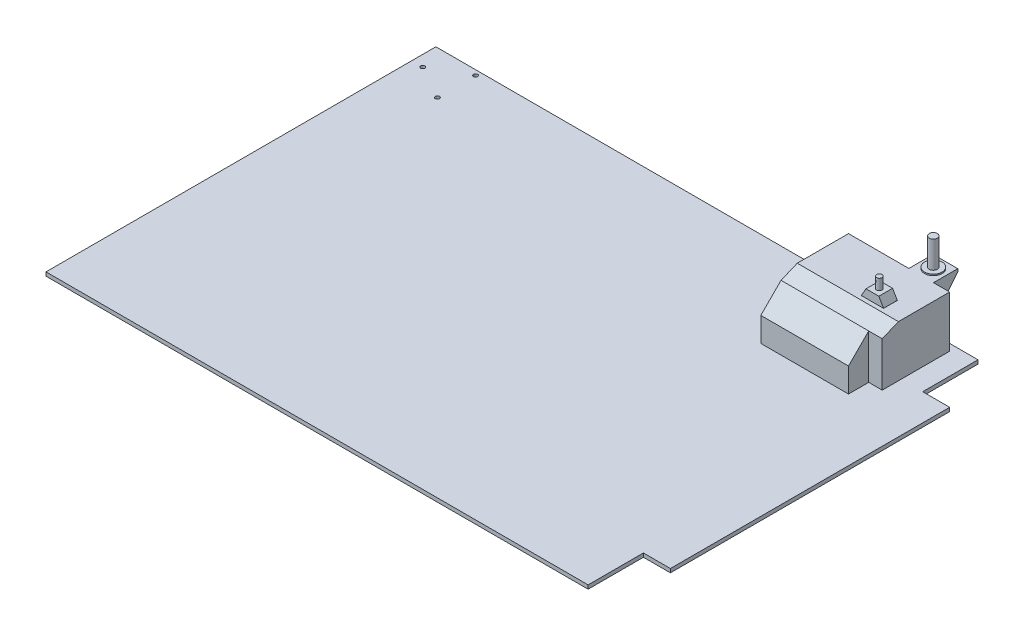
ISO-10303-21;
HEADER;
FILE_DESCRIPTION(('STEP AP214'),'2;1');
FILE_NAME('part.step','',(''),(''),'','','');
FILE_SCHEMA(('AUTOMOTIVE_DESIGN { 1 0 10303 214 1 1 1 1 }'));
ENDSEC;
DATA;
#1=APPLICATION_CONTEXT('core data for automotive mechanical design processes');
#2=APPLICATION_PROTOCOL_DEFINITION('international standard','automotive_design',2000,#1);
#3=PRODUCT_CONTEXT('',#1,'mechanical');
#4=PRODUCT('Part','Part','',(#3));
#5=PRODUCT_RELATED_PRODUCT_CATEGORY('part','',(#4));
#6=PRODUCT_DEFINITION_FORMATION('','',#4);
#7=PRODUCT_DEFINITION_CONTEXT('part definition',#1,'design');
#8=PRODUCT_DEFINITION('design','',#6,#7);
#9=PRODUCT_DEFINITION_SHAPE('','',#8);
#10=(LENGTH_UNIT() NAMED_UNIT(*) SI_UNIT(.MILLI.,.METRE.));
#11=(NAMED_UNIT(*) PLANE_ANGLE_UNIT() SI_UNIT($,.RADIAN.));
#12=(NAMED_UNIT(*) SI_UNIT($,.STERADIAN.) SOLID_ANGLE_UNIT());
#13=UNCERTAINTY_MEASURE_WITH_UNIT(LENGTH_MEASURE(1.E-05),#10,'distance_accuracy_value','');
#14=(GEOMETRIC_REPRESENTATION_CONTEXT(3) GLOBAL_UNCERTAINTY_ASSIGNED_CONTEXT((#13)) GLOBAL_UNIT_ASSIGNED_CONTEXT((#10,
#11,#12)) REPRESENTATION_CONTEXT('',''));
#15=CARTESIAN_POINT('',(0.,0.,0.));
#16=DIRECTION('',(0.,0.,1.));
#17=DIRECTION('',(1.,0.,0.));
#18=AXIS2_PLACEMENT_3D('',#15,#16,#17);
#19=CARTESIAN_POINT('',(0.,40.8,0.));
#20=DIRECTION('',(0.,1.,0.));
#21=DIRECTION('',(0.,0.,1.));
#22=AXIS2_PLACEMENT_3D('',#19,#20,#21);
#23=PLANE('',#22);
#24=CARTESIAN_POINT('',(153.798223583393,40.8,-148.5));
#25=DIRECTION('',(0.,1.,0.));
#26=DIRECTION('',(0.,0.,1.));
#27=AXIS2_PLACEMENT_3D('',#24,#25,#26);
#28=CIRCLE('',#27,6.50000000000002);
#29=CARTESIAN_POINT('',(153.798223583393,40.8,-142.));
#30=VERTEX_POINT('',#29);
#31=EDGE_CURVE('E440',#30,#30,#28,.T.);
#32=ORIENTED_EDGE('',*,*,#31,.F.);
#33=EDGE_LOOP('',(#32));
#34=FACE_BOUND('',#33,.T.);
#35=DIRECTION('',(-1.,0.,0.));
#36=VECTOR('',#35,1.);
#37=CARTESIAN_POINT('',(0.,40.8,-101.5));
#38=LINE('',#37,#36);
#39=CARTESIAN_POINT('',(174.93,40.8,-101.5));
#40=VERTEX_POINT('',#39);
#41=CARTESIAN_POINT('',(99.93,40.8,-101.5));
#42=VERTEX_POINT('',#41);
#43=EDGE_CURVE('E409',#40,#42,#38,.T.);
#44=ORIENTED_EDGE('',*,*,#43,.F.);
#45=DIRECTION('',(0.,0.,1.));
#46=VECTOR('',#45,1.);
#47=CARTESIAN_POINT('',(174.93,40.8,-139.5));
#48=LINE('',#47,#46);
#49=CARTESIAN_POINT('',(174.93,40.8,-139.5));
#50=VERTEX_POINT('',#49);
#51=EDGE_CURVE('E313',#50,#40,#48,.T.);
#52=ORIENTED_EDGE('',*,*,#51,.F.);
#53=DIRECTION('',(-1.,0.,0.));
#54=VECTOR('',#53,1.);
#55=CARTESIAN_POINT('',(174.93,40.8,-139.5));
#56=LINE('',#55,#54);
#57=CARTESIAN_POINT('',(162.93,40.8,-139.5));
#58=VERTEX_POINT('',#57);
#59=EDGE_CURVE('E306',#50,#58,#56,.T.);
#60=ORIENTED_EDGE('',*,*,#59,.T.);
#61=DIRECTION('',(0.,0.,1.));
#62=VECTOR('',#61,1.);
#63=CARTESIAN_POINT('',(162.93,40.8,-157.5));
#64=LINE('',#63,#62);
#65=CARTESIAN_POINT('',(162.93,40.8,-157.5));
#66=VERTEX_POINT('',#65);
#67=EDGE_CURVE('E241',#66,#58,#64,.T.);
#68=ORIENTED_EDGE('',*,*,#67,.F.);
#69=DIRECTION('',(-1.,0.,0.));
#70=VECTOR('',#69,1.);
#71=CARTESIAN_POINT('',(162.93,40.8,-157.5));
#72=LINE('',#71,#70);
#73=CARTESIAN_POINT('',(144.666447166787,40.8,-157.5));
#74=VERTEX_POINT('',#73);
#75=EDGE_CURVE('E239',#66,#74,#72,.T.);
#76=ORIENTED_EDGE('',*,*,#75,.T.);
#77=DIRECTION('',(0.,0.,1.));
#78=VECTOR('',#77,1.);
#79=CARTESIAN_POINT('',(144.666447166787,40.8,-157.5));
#80=LINE('',#79,#78);
#81=CARTESIAN_POINT('',(144.666447166787,40.8,-139.5));
#82=VERTEX_POINT('',#81);
#83=EDGE_CURVE('E255',#74,#82,#80,.T.);
#84=ORIENTED_EDGE('',*,*,#83,.T.);
#85=CARTESIAN_POINT('',(99.93,40.8,-139.5));
#86=VERTEX_POINT('',#85);
#87=EDGE_CURVE('E310',#82,#86,#56,.T.);
#88=ORIENTED_EDGE('',*,*,#87,.T.);
#89=DIRECTION('',(0.,0.,1.));
#90=VECTOR('',#89,1.);
#91=CARTESIAN_POINT('',(99.93,40.8,-139.5));
#92=LINE('',#91,#90);
#93=EDGE_CURVE('E309',#86,#42,#92,.T.);
#94=ORIENTED_EDGE('',*,*,#93,.T.);
#95=EDGE_LOOP('',(#44,#52,#60,#68,#76,#84,#88,#94));
#96=FACE_BOUND('',#95,.T.);
#97=DIRECTION('',(-1.,0.,0.));
#98=VECTOR('',#97,1.);
#99=CARTESIAN_POINT('',(160.93,40.8,-114.672895169853));
#100=LINE('',#99,#98);
#101=CARTESIAN_POINT('',(160.93,40.8,-114.672895169853));
#102=VERTEX_POINT('',#101);
#103=CARTESIAN_POINT('',(144.437579042814,40.8,-114.672895169853));
#104=VERTEX_POINT('',#103);
#105=EDGE_CURVE('E276',#102,#104,#100,.T.);
#106=ORIENTED_EDGE('',*,*,#105,.F.);
#107=DIRECTION('',(0.,0.,-1.));
#108=VECTOR('',#107,1.);
#109=CARTESIAN_POINT('',(160.93,40.8,-104.5));
#110=LINE('',#109,#108);
#111=CARTESIAN_POINT('',(160.93,40.8,-104.5));
#112=VERTEX_POINT('',#111);
#113=EDGE_CURVE('E262',#112,#102,#110,.T.);
#114=ORIENTED_EDGE('',*,*,#113,.F.);
#115=DIRECTION('',(1.,0.,0.));
#116=VECTOR('',#115,1.);
#117=CARTESIAN_POINT('',(160.93,40.8,-104.5));
#118=LINE('',#117,#116);
#119=CARTESIAN_POINT('',(144.437579042814,40.8,-104.5));
#120=VERTEX_POINT('',#119);
#121=EDGE_CURVE('E270',#120,#112,#118,.T.);
#122=ORIENTED_EDGE('',*,*,#121,.F.);
#123=DIRECTION('',(0.,0.,1.));
#124=VECTOR('',#123,1.);
#125=CARTESIAN_POINT('',(144.437579042814,40.8,-104.5));
#126=LINE('',#125,#124);
#127=EDGE_CURVE('E279',#104,#120,#126,.T.);
#128=ORIENTED_EDGE('',*,*,#127,.F.);
#129=EDGE_LOOP('',(#106,#114,#122,#128));
#130=FACE_BOUND('',#129,.T.);
#131=ADVANCED_FACE('F38',(#34,#96,#130),#23,.T.);
#132=CARTESIAN_POINT('',(0.,2.8,0.));
#133=DIRECTION('',(0.,1.,0.));
#134=DIRECTION('',(0.,0.,1.));
#135=AXIS2_PLACEMENT_3D('',#132,#133,#134);
#136=PLANE('',#135);
#137=CARTESIAN_POINT('',(-177.78113513011,2.8,-112.490742035634));
#138=DIRECTION('',(0.,1.,0.));
#139=DIRECTION('',(0.,0.,1.));
#140=AXIS2_PLACEMENT_3D('',#137,#138,#139);
#141=CIRCLE('',#140,1.54999999999999);
#142=CARTESIAN_POINT('',(-177.78113513011,2.8,-110.940742035634));
#143=VERTEX_POINT('',#142);
#144=EDGE_CURVE('E431',#143,#143,#141,.T.);
#145=ORIENTED_EDGE('',*,*,#144,.F.);
#146=EDGE_LOOP('',(#145));
#147=FACE_BOUND('',#146,.T.);
#148=CARTESIAN_POINT('',(-202.78113513011,2.8,-126.640742035634));
#149=DIRECTION('',(0.,1.,0.));
#150=DIRECTION('',(0.,0.,1.));
#151=AXIS2_PLACEMENT_3D('',#148,#149,#150);
#152=CIRCLE('',#151,1.54999999999999);
#153=CARTESIAN_POINT('',(-202.78113513011,2.8,-125.090742035634));
#154=VERTEX_POINT('',#153);
#155=EDGE_CURVE('E789',#154,#154,#152,.T.);
#156=ORIENTED_EDGE('',*,*,#155,.F.);
#157=EDGE_LOOP('',(#156));
#158=FACE_BOUND('',#157,.T.);
#159=CARTESIAN_POINT('',(-177.78113513011,2.8,-140.790742035634));
#160=DIRECTION('',(0.,1.,0.));
#161=DIRECTION('',(0.,0.,1.));
#162=AXIS2_PLACEMENT_3D('',#159,#160,#161);
#163=CIRCLE('',#162,1.54999999999999);
#164=CARTESIAN_POINT('',(-177.78113513011,2.8,-139.240742035634));
#165=VERTEX_POINT('',#164);
#166=EDGE_CURVE('E447',#165,#165,#163,.T.);
#167=ORIENTED_EDGE('',*,*,#166,.F.);
#168=EDGE_LOOP('',(#167));
#169=FACE_BOUND('',#168,.T.);
#170=DIRECTION('',(0.,0.,-1.));
#171=VECTOR('',#170,1.);
#172=CARTESIAN_POINT('',(210.93,2.8,-144.5));
#173=LINE('',#172,#171);
#174=CARTESIAN_POINT('',(210.93,2.8,103.5));
#175=VERTEX_POINT('',#174);
#176=CARTESIAN_POINT('',(210.93,2.8,-103.5));
#177=VERTEX_POINT('',#176);
#178=EDGE_CURVE('E384',#175,#177,#173,.T.);
#179=ORIENTED_EDGE('',*,*,#178,.T.);
#180=DIRECTION('',(-1.,0.,0.));
#181=VECTOR('',#180,1.);
#182=CARTESIAN_POINT('',(210.93,2.8,-103.5));
#183=LINE('',#182,#181);
#184=CARTESIAN_POINT('',(190.93,2.8,-103.5));
#185=VERTEX_POINT('',#184);
#186=EDGE_CURVE('E355',#177,#185,#183,.T.);
#187=ORIENTED_EDGE('',*,*,#186,.T.);
#188=DIRECTION('',(0.,0.,1.));
#189=VECTOR('',#188,1.);
#190=CARTESIAN_POINT('',(190.93,2.8,-144.5));
#191=LINE('',#190,#189);
#192=CARTESIAN_POINT('',(190.93,2.8,-144.5));
#193=VERTEX_POINT('',#192);
#194=EDGE_CURVE('E351',#193,#185,#191,.T.);
#195=ORIENTED_EDGE('',*,*,#194,.F.);
#196=DIRECTION('',(-1.,0.,0.));
#197=VECTOR('',#196,1.);
#198=CARTESIAN_POINT('',(-210.93,2.8,-144.5));
#199=LINE('',#198,#197);
#200=CARTESIAN_POINT('',(-210.93,2.8,-144.5));
#201=VERTEX_POINT('',#200);
#202=EDGE_CURVE('E387',#193,#201,#199,.T.);
#203=ORIENTED_EDGE('',*,*,#202,.T.);
#204=DIRECTION('',(0.,0.,1.));
#205=VECTOR('',#204,1.);
#206=CARTESIAN_POINT('',(-210.93,2.8,-144.5));
#207=LINE('',#206,#205);
#208=CARTESIAN_POINT('',(-210.93,2.8,144.5));
#209=VERTEX_POINT('',#208);
#210=EDGE_CURVE('E390',#201,#209,#207,.T.);
#211=ORIENTED_EDGE('',*,*,#210,.T.);
#212=DIRECTION('',(1.,0.,0.));
#213=VECTOR('',#212,1.);
#214=CARTESIAN_POINT('',(-210.93,2.8,144.5));
#215=LINE('',#214,#213);
#216=CARTESIAN_POINT('',(190.93,2.8,144.5));
#217=VERTEX_POINT('',#216);
#218=EDGE_CURVE('E392',#209,#217,#215,.T.);
#219=ORIENTED_EDGE('',*,*,#218,.T.);
#220=DIRECTION('',(0.,0.,-1.));
#221=VECTOR('',#220,1.);
#222=CARTESIAN_POINT('',(190.93,2.8,144.5));
#223=LINE('',#222,#221);
#224=CARTESIAN_POINT('',(190.93,2.8,103.5));
#225=VERTEX_POINT('',#224);
#226=EDGE_CURVE('E375',#217,#225,#223,.T.);
#227=ORIENTED_EDGE('',*,*,#226,.T.);
#228=DIRECTION('',(-1.,0.,0.));
#229=VECTOR('',#228,1.);
#230=CARTESIAN_POINT('',(210.93,2.8,103.5));
#231=LINE('',#230,#229);
#232=EDGE_CURVE('E358',#175,#225,#231,.T.);
#233=ORIENTED_EDGE('',*,*,#232,.F.);
#234=EDGE_LOOP('',(#179,#187,#195,#203,#211,#219,#227,#233));
#235=FACE_BOUND('',#234,.T.);
#236=DIRECTION('',(0.,0.,-1.));
#237=VECTOR('',#236,1.);
#238=CARTESIAN_POINT('',(99.93,2.8,-74.5));
#239=LINE('',#238,#237);
#240=CARTESIAN_POINT('',(99.93,2.8,-74.5));
#241=VERTEX_POINT('',#240);
#242=CARTESIAN_POINT('',(99.9299999999999,2.8,-139.5));
#243=VERTEX_POINT('',#242);
#244=EDGE_CURVE('E319',#241,#243,#239,.T.);
#245=ORIENTED_EDGE('',*,*,#244,.T.);
#246=DIRECTION('',(-1.,0.,0.));
#247=VECTOR('',#246,1.);
#248=CARTESIAN_POINT('',(174.93,2.8,-139.5));
#249=LINE('',#248,#247);
#250=CARTESIAN_POINT('',(174.93,2.8,-139.5));
#251=VERTEX_POINT('',#250);
#252=EDGE_CURVE('E305',#251,#243,#249,.T.);
#253=ORIENTED_EDGE('',*,*,#252,.F.);
#254=DIRECTION('',(0.,0.,1.));
#255=VECTOR('',#254,1.);
#256=CARTESIAN_POINT('',(174.93,2.8,-139.5));
#257=LINE('',#256,#255);
#258=CARTESIAN_POINT('',(174.93,2.8,-89.5));
#259=VERTEX_POINT('',#258);
#260=EDGE_CURVE('E330',#251,#259,#257,.T.);
#261=ORIENTED_EDGE('',*,*,#260,.T.);
#262=DIRECTION('',(-1.,0.,0.));
#263=VECTOR('',#262,1.);
#264=CARTESIAN_POINT('',(174.93,2.8,-89.5));
#265=LINE('',#264,#263);
#266=CARTESIAN_POINT('',(164.93,2.8,-89.5));
#267=VERTEX_POINT('',#266);
#268=EDGE_CURVE('E327',#259,#267,#265,.T.);
#269=ORIENTED_EDGE('',*,*,#268,.T.);
#270=DIRECTION('',(0.,0.,1.));
#271=VECTOR('',#270,1.);
#272=CARTESIAN_POINT('',(164.93,2.8,-89.5));
#273=LINE('',#272,#271);
#274=CARTESIAN_POINT('',(164.93,2.8,-74.5));
#275=VERTEX_POINT('',#274);
#276=EDGE_CURVE('E324',#267,#275,#273,.T.);
#277=ORIENTED_EDGE('',*,*,#276,.T.);
#278=DIRECTION('',(-1.,0.,0.));
#279=VECTOR('',#278,1.);
#280=CARTESIAN_POINT('',(164.93,2.8,-74.5));
#281=LINE('',#280,#279);
#282=EDGE_CURVE('E321',#275,#241,#281,.T.);
#283=ORIENTED_EDGE('',*,*,#282,.T.);
#284=EDGE_LOOP('',(#245,#253,#261,#269,#277,#283));
#285=FACE_BOUND('',#284,.T.);
#286=ADVANCED_FACE('F476',(#147,#158,#169,#235,#285),#136,.T.);
#287=CARTESIAN_POINT('',(210.93,2.8,-144.5));
#288=DIRECTION('',(-1.,0.,0.));
#289=DIRECTION('',(0.,0.,1.));
#290=AXIS2_PLACEMENT_3D('',#287,#288,#289);
#291=PLANE('',#290);
#292=DIRECTION('',(0.,1.,0.));
#293=VECTOR('',#292,1.);
#294=CARTESIAN_POINT('',(210.93,0.,-103.5));
#295=LINE('',#294,#293);
#296=CARTESIAN_POINT('',(210.93,0.,-103.5));
#297=VERTEX_POINT('',#296);
#298=EDGE_CURVE('E354',#297,#177,#295,.T.);
#299=ORIENTED_EDGE('',*,*,#298,.T.);
#300=ORIENTED_EDGE('',*,*,#178,.F.);
#301=DIRECTION('',(0.,1.,0.));
#302=VECTOR('',#301,1.);
#303=CARTESIAN_POINT('',(210.93,0.,103.5));
#304=LINE('',#303,#302);
#305=CARTESIAN_POINT('',(210.93,0.,103.5));
#306=VERTEX_POINT('',#305);
#307=EDGE_CURVE('E346',#306,#175,#304,.T.);
#308=ORIENTED_EDGE('',*,*,#307,.F.);
#309=DIRECTION('',(0.,0.,-1.));
#310=VECTOR('',#309,1.);
#311=CARTESIAN_POINT('',(210.93,0.,-144.5));
#312=LINE('',#311,#310);
#313=EDGE_CURVE('E367',#306,#297,#312,.T.);
#314=ORIENTED_EDGE('',*,*,#313,.T.);
#315=EDGE_LOOP('',(#299,#300,#308,#314));
#316=FACE_BOUND('',#315,.T.);
#317=ADVANCED_FACE('F482',(#316),#291,.F.);
#318=CARTESIAN_POINT('',(-210.93,2.8,144.5));
#319=DIRECTION('',(0.,0.,-1.));
#320=DIRECTION('',(-1.,0.,0.));
#321=AXIS2_PLACEMENT_3D('',#318,#319,#320);
#322=PLANE('',#321);
#323=DIRECTION('',(0.,1.,0.));
#324=VECTOR('',#323,1.);
#325=CARTESIAN_POINT('',(190.93,0.,144.5));
#326=LINE('',#325,#324);
#327=CARTESIAN_POINT('',(190.93,0.,144.5));
#328=VERTEX_POINT('',#327);
#329=EDGE_CURVE('E371',#328,#217,#326,.T.);
#330=ORIENTED_EDGE('',*,*,#329,.T.);
#331=ORIENTED_EDGE('',*,*,#218,.F.);
#332=DIRECTION('',(0.,-1.,0.));
#333=VECTOR('',#332,1.);
#334=CARTESIAN_POINT('',(-210.93,2.8,144.5));
#335=LINE('',#334,#333);
#336=CARTESIAN_POINT('',(-210.93,0.,144.5));
#337=VERTEX_POINT('',#336);
#338=EDGE_CURVE('E395',#209,#337,#335,.T.);
#339=ORIENTED_EDGE('',*,*,#338,.T.);
#340=DIRECTION('',(1.,0.,0.));
#341=VECTOR('',#340,1.);
#342=CARTESIAN_POINT('',(-210.93,0.,144.5));
#343=LINE('',#342,#341);
#344=EDGE_CURVE('E388',#337,#328,#343,.T.);
#345=ORIENTED_EDGE('',*,*,#344,.T.);
#346=EDGE_LOOP('',(#330,#331,#339,#345));
#347=FACE_BOUND('',#346,.T.);
#348=ADVANCED_FACE('F533',(#347),#322,.F.);
#349=CARTESIAN_POINT('',(0.,0.,0.));
#350=DIRECTION('',(0.,1.,0.));
#351=DIRECTION('',(0.,0.,1.));
#352=AXIS2_PLACEMENT_3D('',#349,#350,#351);
#353=PLANE('',#352);
#354=CARTESIAN_POINT('',(-177.78113513011,0.,-112.490742035634));
#355=DIRECTION('',(0.,1.,0.));
#356=DIRECTION('',(0.,0.,1.));
#357=AXIS2_PLACEMENT_3D('',#354,#355,#356);
#358=CIRCLE('',#357,1.54999999999999);
#359=CARTESIAN_POINT('',(-177.78113513011,0.,-110.940742035634));
#360=VERTEX_POINT('',#359);
#361=EDGE_CURVE('E43',#360,#360,#358,.T.);
#362=ORIENTED_EDGE('',*,*,#361,.T.);
#363=EDGE_LOOP('',(#362));
#364=FACE_BOUND('',#363,.T.);
#365=CARTESIAN_POINT('',(-202.78113513011,0.,-126.640742035634));
#366=DIRECTION('',(0.,1.,0.));
#367=DIRECTION('',(0.,0.,1.));
#368=AXIS2_PLACEMENT_3D('',#365,#366,#367);
#369=CIRCLE('',#368,1.54999999999999);
#370=CARTESIAN_POINT('',(-202.78113513011,0.,-125.090742035634));
#371=VERTEX_POINT('',#370);
#372=EDGE_CURVE('E430',#371,#371,#369,.T.);
#373=ORIENTED_EDGE('',*,*,#372,.T.);
#374=EDGE_LOOP('',(#373));
#375=FACE_BOUND('',#374,.T.);
#376=CARTESIAN_POINT('',(-177.78113513011,0.,-140.790742035634));
#377=DIRECTION('',(0.,1.,0.));
#378=DIRECTION('',(0.,0.,1.));
#379=AXIS2_PLACEMENT_3D('',#376,#377,#378);
#380=CIRCLE('',#379,1.54999999999999);
#381=CARTESIAN_POINT('',(-177.78113513011,0.,-139.240742035634));
#382=VERTEX_POINT('',#381);
#383=EDGE_CURVE('E428',#382,#382,#380,.T.);
#384=ORIENTED_EDGE('',*,*,#383,.T.);
#385=EDGE_LOOP('',(#384));
#386=FACE_BOUND('',#385,.T.);
#387=DIRECTION('',(-1.,0.,0.));
#388=VECTOR('',#387,1.);
#389=CARTESIAN_POINT('',(210.93,0.,-103.5));
#390=LINE('',#389,#388);
#391=CARTESIAN_POINT('',(190.93,0.,-103.5));
#392=VERTEX_POINT('',#391);
#393=EDGE_CURVE('E347',#297,#392,#390,.T.);
#394=ORIENTED_EDGE('',*,*,#393,.F.);
#395=ORIENTED_EDGE('',*,*,#313,.F.);
#396=DIRECTION('',(-1.,0.,0.));
#397=VECTOR('',#396,1.);
#398=CARTESIAN_POINT('',(210.93,0.,103.5));
#399=LINE('',#398,#397);
#400=CARTESIAN_POINT('',(190.93,0.,103.5));
#401=VERTEX_POINT('',#400);
#402=EDGE_CURVE('E378',#306,#401,#399,.T.);
#403=ORIENTED_EDGE('',*,*,#402,.T.);
#404=DIRECTION('',(0.,0.,-1.));
#405=VECTOR('',#404,1.);
#406=CARTESIAN_POINT('',(190.93,0.,144.5));
#407=LINE('',#406,#405);
#408=EDGE_CURVE('E370',#328,#401,#407,.T.);
#409=ORIENTED_EDGE('',*,*,#408,.F.);
#410=ORIENTED_EDGE('',*,*,#344,.F.);
#411=DIRECTION('',(0.,0.,1.));
#412=VECTOR('',#411,1.);
#413=CARTESIAN_POINT('',(-210.93,0.,-144.5));
#414=LINE('',#413,#412);
#415=CARTESIAN_POINT('',(-210.93,0.,-144.5));
#416=VERTEX_POINT('',#415);
#417=EDGE_CURVE('E400',#416,#337,#414,.T.);
#418=ORIENTED_EDGE('',*,*,#417,.F.);
#419=DIRECTION('',(-1.,0.,0.));
#420=VECTOR('',#419,1.);
#421=CARTESIAN_POINT('',(-210.93,0.,-144.5));
#422=LINE('',#421,#420);
#423=CARTESIAN_POINT('',(190.93,0.,-144.5));
#424=VERTEX_POINT('',#423);
#425=EDGE_CURVE('E398',#424,#416,#422,.T.);
#426=ORIENTED_EDGE('',*,*,#425,.F.);
#427=DIRECTION('',(0.,0.,1.));
#428=VECTOR('',#427,1.);
#429=CARTESIAN_POINT('',(190.93,0.,-144.5));
#430=LINE('',#429,#428);
#431=EDGE_CURVE('E350',#424,#392,#430,.T.);
#432=ORIENTED_EDGE('',*,*,#431,.T.);
#433=EDGE_LOOP('',(#394,#395,#403,#409,#410,#418,#426,#432));
#434=FACE_BOUND('',#433,.T.);
#435=ADVANCED_FACE('F529',(#364,#375,#386,#434),#353,.F.);
#436=CARTESIAN_POINT('',(-210.93,2.8,-144.5));
#437=DIRECTION('',(0.,0.,1.));
#438=DIRECTION('',(1.,0.,0.));
#439=AXIS2_PLACEMENT_3D('',#436,#437,#438);
#440=PLANE('',#439);
#441=ORIENTED_EDGE('',*,*,#202,.F.);
#442=DIRECTION('',(0.,1.,0.));
#443=VECTOR('',#442,1.);
#444=CARTESIAN_POINT('',(190.93,0.,-144.5));
#445=LINE('',#444,#443);
#446=EDGE_CURVE('E363',#424,#193,#445,.T.);
#447=ORIENTED_EDGE('',*,*,#446,.F.);
#448=ORIENTED_EDGE('',*,*,#425,.T.);
#449=DIRECTION('',(0.,-1.,0.));
#450=VECTOR('',#449,1.);
#451=CARTESIAN_POINT('',(-210.93,2.8,-144.5));
#452=LINE('',#451,#450);
#453=EDGE_CURVE('E406',#201,#416,#452,.T.);
#454=ORIENTED_EDGE('',*,*,#453,.F.);
#455=EDGE_LOOP('',(#441,#447,#448,#454));
#456=FACE_BOUND('',#455,.T.);
#457=ADVANCED_FACE('F532',(#456),#440,.F.);
#458=CARTESIAN_POINT('',(-210.93,2.8,-144.5));
#459=DIRECTION('',(1.,0.,0.));
#460=DIRECTION('',(0.,0.,-1.));
#461=AXIS2_PLACEMENT_3D('',#458,#459,#460);
#462=PLANE('',#461);
#463=ORIENTED_EDGE('',*,*,#417,.T.);
#464=ORIENTED_EDGE('',*,*,#338,.F.);
#465=ORIENTED_EDGE('',*,*,#210,.F.);
#466=ORIENTED_EDGE('',*,*,#453,.T.);
#467=EDGE_LOOP('',(#463,#464,#465,#466));
#468=FACE_BOUND('',#467,.T.);
#469=ADVANCED_FACE('F524',(#468),#462,.F.);
#470=CARTESIAN_POINT('',(210.93,0.,103.5));
#471=DIRECTION('',(0.,0.,-1.));
#472=DIRECTION('',(-1.,0.,0.));
#473=AXIS2_PLACEMENT_3D('',#470,#471,#472);
#474=PLANE('',#473);
#475=ORIENTED_EDGE('',*,*,#232,.T.);
#476=DIRECTION('',(0.,1.,0.));
#477=VECTOR('',#476,1.);
#478=CARTESIAN_POINT('',(190.93,0.,103.5));
#479=LINE('',#478,#477);
#480=EDGE_CURVE('E368',#401,#225,#479,.T.);
#481=ORIENTED_EDGE('',*,*,#480,.F.);
#482=ORIENTED_EDGE('',*,*,#402,.F.);
#483=ORIENTED_EDGE('',*,*,#307,.T.);
#484=EDGE_LOOP('',(#475,#481,#482,#483));
#485=FACE_BOUND('',#484,.T.);
#486=ADVANCED_FACE('F521',(#485),#474,.F.);
#487=CARTESIAN_POINT('',(190.93,0.,144.5));
#488=DIRECTION('',(1.,0.,0.));
#489=DIRECTION('',(0.,0.,-1.));
#490=AXIS2_PLACEMENT_3D('',#487,#488,#489);
#491=PLANE('',#490);
#492=ORIENTED_EDGE('',*,*,#226,.F.);
#493=ORIENTED_EDGE('',*,*,#329,.F.);
#494=ORIENTED_EDGE('',*,*,#408,.T.);
#495=ORIENTED_EDGE('',*,*,#480,.T.);
#496=EDGE_LOOP('',(#492,#493,#494,#495));
#497=FACE_BOUND('',#496,.T.);
#498=ADVANCED_FACE('F519',(#497),#491,.T.);
#499=CARTESIAN_POINT('',(210.93,0.,-103.5));
#500=DIRECTION('',(0.,0.,-1.));
#501=DIRECTION('',(-1.,0.,0.));
#502=AXIS2_PLACEMENT_3D('',#499,#500,#501);
#503=PLANE('',#502);
#504=ORIENTED_EDGE('',*,*,#186,.F.);
#505=ORIENTED_EDGE('',*,*,#298,.F.);
#506=ORIENTED_EDGE('',*,*,#393,.T.);
#507=DIRECTION('',(0.,1.,0.));
#508=VECTOR('',#507,1.);
#509=CARTESIAN_POINT('',(190.93,0.,-103.5));
#510=LINE('',#509,#508);
#511=EDGE_CURVE('E365',#392,#185,#510,.T.);
#512=ORIENTED_EDGE('',*,*,#511,.T.);
#513=EDGE_LOOP('',(#504,#505,#506,#512));
#514=FACE_BOUND('',#513,.T.);
#515=ADVANCED_FACE('F515',(#514),#503,.T.);
#516=CARTESIAN_POINT('',(190.93,0.,-144.5));
#517=DIRECTION('',(-1.,0.,0.));
#518=DIRECTION('',(0.,0.,1.));
#519=AXIS2_PLACEMENT_3D('',#516,#517,#518);
#520=PLANE('',#519);
#521=ORIENTED_EDGE('',*,*,#194,.T.);
#522=ORIENTED_EDGE('',*,*,#511,.F.);
#523=ORIENTED_EDGE('',*,*,#431,.F.);
#524=ORIENTED_EDGE('',*,*,#446,.T.);
#525=EDGE_LOOP('',(#521,#522,#523,#524));
#526=FACE_BOUND('',#525,.T.);
#527=ADVANCED_FACE('F512',(#526),#520,.F.);
#528=CARTESIAN_POINT('',(174.93,40.8,-139.5));
#529=DIRECTION('',(0.,0.,1.));
#530=DIRECTION('',(1.,0.,0.));
#531=AXIS2_PLACEMENT_3D('',#528,#529,#530);
#532=PLANE('',#531);
#533=ORIENTED_EDGE('',*,*,#87,.F.);
#534=DIRECTION('',(0.,-1.,0.));
#535=VECTOR('',#534,1.);
#536=CARTESIAN_POINT('',(144.666447166787,40.8,-139.5));
#537=LINE('',#536,#535);
#538=CARTESIAN_POINT('',(144.666447166787,21.8,-139.5));
#539=VERTEX_POINT('',#538);
#540=EDGE_CURVE('E250',#82,#539,#537,.T.);
#541=ORIENTED_EDGE('',*,*,#540,.T.);
#542=DIRECTION('',(-1.,0.,0.));
#543=VECTOR('',#542,1.);
#544=CARTESIAN_POINT('',(162.93,21.8,-139.5));
#545=LINE('',#544,#543);
#546=CARTESIAN_POINT('',(162.93,21.8,-139.5));
#547=VERTEX_POINT('',#546);
#548=EDGE_CURVE('E247',#547,#539,#545,.T.);
#549=ORIENTED_EDGE('',*,*,#548,.F.);
#550=DIRECTION('',(0.,-1.,0.));
#551=VECTOR('',#550,1.);
#552=CARTESIAN_POINT('',(162.93,40.8,-139.5));
#553=LINE('',#552,#551);
#554=EDGE_CURVE('E252',#58,#547,#553,.T.);
#555=ORIENTED_EDGE('',*,*,#554,.F.);
#556=ORIENTED_EDGE('',*,*,#59,.F.);
#557=DIRECTION('',(0.,-1.,0.));
#558=VECTOR('',#557,1.);
#559=CARTESIAN_POINT('',(174.93,40.8,-139.5));
#560=LINE('',#559,#558);
#561=EDGE_CURVE('E316',#50,#251,#560,.T.);
#562=ORIENTED_EDGE('',*,*,#561,.T.);
#563=ORIENTED_EDGE('',*,*,#252,.T.);
#564=DIRECTION('',(0.,-1.,0.));
#565=VECTOR('',#564,1.);
#566=CARTESIAN_POINT('',(99.93,40.8,-139.5));
#567=LINE('',#566,#565);
#568=EDGE_CURVE('E343',#86,#243,#567,.T.);
#569=ORIENTED_EDGE('',*,*,#568,.F.);
#570=EDGE_LOOP('',(#533,#541,#549,#555,#556,#562,#563,#569));
#571=FACE_BOUND('',#570,.T.);
#572=ADVANCED_FACE('F461',(#571),#532,.F.);
#573=CARTESIAN_POINT('',(99.93,40.8,-74.5));
#574=DIRECTION('',(-1.,0.,0.));
#575=DIRECTION('',(0.,0.,1.));
#576=AXIS2_PLACEMENT_3D('',#573,#574,#575);
#577=PLANE('',#576);
#578=DIRECTION('',(0.,-0.707106781186548,0.707106781186548));
#579=VECTOR('',#578,1.);
#580=CARTESIAN_POINT('',(99.93,30.8,-84.5));
#581=LINE('',#580,#579);
#582=CARTESIAN_POINT('',(99.93,35.8,-89.5));
#583=VERTEX_POINT('',#582);
#584=CARTESIAN_POINT('',(99.93,20.8,-74.5));
#585=VERTEX_POINT('',#584);
#586=EDGE_CURVE('E295',#583,#585,#581,.T.);
#587=ORIENTED_EDGE('',*,*,#586,.F.);
#588=DIRECTION('',(0.,-0.384615384615384,0.923076923076923));
#589=VECTOR('',#588,1.);
#590=CARTESIAN_POINT('',(99.93,31.2142011834319,-78.4940828402367));
#591=LINE('',#590,#589);
#592=EDGE_CURVE('E302',#42,#583,#591,.T.);
#593=ORIENTED_EDGE('',*,*,#592,.F.);
#594=ORIENTED_EDGE('',*,*,#93,.F.);
#595=ORIENTED_EDGE('',*,*,#568,.T.);
#596=ORIENTED_EDGE('',*,*,#244,.F.);
#597=DIRECTION('',(0.,-1.,0.));
#598=VECTOR('',#597,1.);
#599=CARTESIAN_POINT('',(99.93,40.8,-74.5));
#600=LINE('',#599,#598);
#601=EDGE_CURVE('E341',#585,#241,#600,.T.);
#602=ORIENTED_EDGE('',*,*,#601,.F.);
#603=EDGE_LOOP('',(#587,#593,#594,#595,#596,#602));
#604=FACE_BOUND('',#603,.T.);
#605=ADVANCED_FACE('F505',(#604),#577,.T.);
#606=CARTESIAN_POINT('',(164.93,40.8,-74.5));
#607=DIRECTION('',(0.,0.,1.));
#608=DIRECTION('',(1.,0.,0.));
#609=AXIS2_PLACEMENT_3D('',#606,#607,#608);
#610=PLANE('',#609);
#611=DIRECTION('',(1.,0.,0.));
#612=VECTOR('',#611,1.);
#613=CARTESIAN_POINT('',(-210.93,20.8,-74.5));
#614=LINE('',#613,#612);
#615=CARTESIAN_POINT('',(164.93,20.8,-74.5));
#616=VERTEX_POINT('',#615);
#617=EDGE_CURVE('E293',#585,#616,#614,.T.);
#618=ORIENTED_EDGE('',*,*,#617,.F.);
#619=ORIENTED_EDGE('',*,*,#601,.T.);
#620=ORIENTED_EDGE('',*,*,#282,.F.);
#621=DIRECTION('',(0.,-1.,0.));
#622=VECTOR('',#621,1.);
#623=CARTESIAN_POINT('',(164.93,40.8,-74.5));
#624=LINE('',#623,#622);
#625=EDGE_CURVE('E339',#616,#275,#624,.T.);
#626=ORIENTED_EDGE('',*,*,#625,.F.);
#627=EDGE_LOOP('',(#618,#619,#620,#626));
#628=FACE_BOUND('',#627,.T.);
#629=ADVANCED_FACE('F501',(#628),#610,.T.);
#630=CARTESIAN_POINT('',(164.93,40.8,-89.5));
#631=DIRECTION('',(1.,0.,0.));
#632=DIRECTION('',(0.,0.,-1.));
#633=AXIS2_PLACEMENT_3D('',#630,#631,#632);
#634=PLANE('',#633);
#635=DIRECTION('',(0.,0.707106781186548,-0.707106781186548));
#636=VECTOR('',#635,1.);
#637=CARTESIAN_POINT('',(164.93,-26.85,-26.85));
#638=LINE('',#637,#636);
#639=CARTESIAN_POINT('',(164.93,35.8,-89.5));
#640=VERTEX_POINT('',#639);
#641=EDGE_CURVE('E291',#616,#640,#638,.T.);
#642=ORIENTED_EDGE('',*,*,#641,.F.);
#643=ORIENTED_EDGE('',*,*,#625,.T.);
#644=ORIENTED_EDGE('',*,*,#276,.F.);
#645=DIRECTION('',(0.,-1.,0.));
#646=VECTOR('',#645,1.);
#647=CARTESIAN_POINT('',(164.93,40.8,-89.5));
#648=LINE('',#647,#646);
#649=EDGE_CURVE('E337',#640,#267,#648,.T.);
#650=ORIENTED_EDGE('',*,*,#649,.F.);
#651=EDGE_LOOP('',(#642,#643,#644,#650));
#652=FACE_BOUND('',#651,.T.);
#653=ADVANCED_FACE('F497',(#652),#634,.T.);
#654=CARTESIAN_POINT('',(174.93,40.8,-89.5));
#655=DIRECTION('',(0.,0.,1.));
#656=DIRECTION('',(1.,0.,0.));
#657=AXIS2_PLACEMENT_3D('',#654,#655,#656);
#658=PLANE('',#657);
#659=DIRECTION('',(1.,0.,0.));
#660=VECTOR('',#659,1.);
#661=CARTESIAN_POINT('',(-210.93,35.8,-89.5));
#662=LINE('',#661,#660);
#663=CARTESIAN_POINT('',(174.93,35.8,-89.5));
#664=VERTEX_POINT('',#663);
#665=EDGE_CURVE('E299',#640,#664,#662,.T.);
#666=ORIENTED_EDGE('',*,*,#665,.F.);
#667=ORIENTED_EDGE('',*,*,#649,.T.);
#668=ORIENTED_EDGE('',*,*,#268,.F.);
#669=DIRECTION('',(0.,-1.,0.));
#670=VECTOR('',#669,1.);
#671=CARTESIAN_POINT('',(174.93,40.8,-89.5));
#672=LINE('',#671,#670);
#673=EDGE_CURVE('E335',#664,#259,#672,.T.);
#674=ORIENTED_EDGE('',*,*,#673,.F.);
#675=EDGE_LOOP('',(#666,#667,#668,#674));
#676=FACE_BOUND('',#675,.T.);
#677=ADVANCED_FACE('F493',(#676),#658,.T.);
#678=CARTESIAN_POINT('',(174.93,40.8,-139.5));
#679=DIRECTION('',(1.,0.,0.));
#680=DIRECTION('',(0.,0.,-1.));
#681=AXIS2_PLACEMENT_3D('',#678,#679,#680);
#682=PLANE('',#681);
#683=DIRECTION('',(0.,0.384615384615385,-0.923076923076923));
#684=VECTOR('',#683,1.);
#685=CARTESIAN_POINT('',(174.93,35.8,-89.5));
#686=LINE('',#685,#684);
#687=EDGE_CURVE('E297',#664,#40,#686,.T.);
#688=ORIENTED_EDGE('',*,*,#687,.F.);
#689=ORIENTED_EDGE('',*,*,#673,.T.);
#690=ORIENTED_EDGE('',*,*,#260,.F.);
#691=ORIENTED_EDGE('',*,*,#561,.F.);
#692=ORIENTED_EDGE('',*,*,#51,.T.);
#693=EDGE_LOOP('',(#688,#689,#690,#691,#692));
#694=FACE_BOUND('',#693,.T.);
#695=ADVANCED_FACE('F490',(#694),#682,.T.);
#696=CARTESIAN_POINT('',(-210.93,35.8,-89.5));
#697=DIRECTION('',(0.,-0.923076923076923,-0.384615384615385));
#698=DIRECTION('',(0.,0.384615384615384,-0.923076923076923));
#699=AXIS2_PLACEMENT_3D('',#696,#697,#698);
#700=PLANE('',#699);
#701=ORIENTED_EDGE('',*,*,#592,.T.);
#702=EDGE_CURVE('E301',#583,#640,#662,.T.);
#703=ORIENTED_EDGE('',*,*,#702,.T.);
#704=ORIENTED_EDGE('',*,*,#665,.T.);
#705=ORIENTED_EDGE('',*,*,#687,.T.);
#706=ORIENTED_EDGE('',*,*,#43,.T.);
#707=EDGE_LOOP('',(#701,#703,#704,#705,#706));
#708=FACE_BOUND('',#707,.T.);
#709=ADVANCED_FACE('F488',(#708),#700,.F.);
#710=CARTESIAN_POINT('',(-210.93,-26.85,-26.85));
#711=DIRECTION('',(0.,-0.707106781186548,-0.707106781186548));
#712=DIRECTION('',(0.,0.707106781186548,-0.707106781186548));
#713=AXIS2_PLACEMENT_3D('',#710,#711,#712);
#714=PLANE('',#713);
#715=ORIENTED_EDGE('',*,*,#586,.T.);
#716=ORIENTED_EDGE('',*,*,#617,.T.);
#717=ORIENTED_EDGE('',*,*,#641,.T.);
#718=ORIENTED_EDGE('',*,*,#702,.F.);
#719=EDGE_LOOP('',(#715,#716,#717,#718));
#720=FACE_BOUND('',#719,.T.);
#721=ADVANCED_FACE('F591',(#720),#714,.F.);
#722=CARTESIAN_POINT('',(160.93,46.86,-104.5));
#723=DIRECTION('',(-1.,0.,0.));
#724=DIRECTION('',(0.,0.,1.));
#725=AXIS2_PLACEMENT_3D('',#722,#723,#724);
#726=PLANE('',#725);
#727=DIRECTION('',(0.,-1.,0.));
#728=VECTOR('',#727,1.);
#729=CARTESIAN_POINT('',(160.93,46.86,-114.672895169853));
#730=LINE('',#729,#728);
#731=CARTESIAN_POINT('',(160.93,40.8599999999999,-114.672895169853));
#732=VERTEX_POINT('',#731);
#733=EDGE_CURVE('E289',#732,#102,#730,.T.);
#734=ORIENTED_EDGE('',*,*,#733,.F.);
#735=DIRECTION('',(0.,0.,1.));
#736=VECTOR('',#735,1.);
#737=CARTESIAN_POINT('',(160.93,40.8599999999999,-104.5));
#738=LINE('',#737,#736);
#739=CARTESIAN_POINT('',(160.93,40.8599999999999,-104.5));
#740=VERTEX_POINT('',#739);
#741=EDGE_CURVE('E421',#732,#740,#738,.T.);
#742=ORIENTED_EDGE('',*,*,#741,.T.);
#743=DIRECTION('',(0.,-1.,0.));
#744=VECTOR('',#743,1.);
#745=CARTESIAN_POINT('',(160.93,46.86,-104.5));
#746=LINE('',#745,#744);
#747=EDGE_CURVE('E273',#740,#112,#746,.T.);
#748=ORIENTED_EDGE('',*,*,#747,.T.);
#749=ORIENTED_EDGE('',*,*,#113,.T.);
#750=EDGE_LOOP('',(#734,#742,#748,#749));
#751=FACE_BOUND('',#750,.T.);
#752=ADVANCED_FACE('F581',(#751),#726,.F.);
#753=CARTESIAN_POINT('',(160.93,46.86,-114.672895169853));
#754=DIRECTION('',(0.,0.,1.));
#755=DIRECTION('',(1.,0.,0.));
#756=AXIS2_PLACEMENT_3D('',#753,#754,#755);
#757=PLANE('',#756);
#758=DIRECTION('',(-1.,0.,0.));
#759=VECTOR('',#758,1.);
#760=CARTESIAN_POINT('',(160.93,46.86,-114.672895169853));
#761=LINE('',#760,#759);
#762=CARTESIAN_POINT('',(157.43,46.86,-114.672895169853));
#763=VERTEX_POINT('',#762);
#764=CARTESIAN_POINT('',(147.937579042814,46.86,-114.672895169853));
#765=VERTEX_POINT('',#764);
#766=EDGE_CURVE('E266',#763,#765,#761,.T.);
#767=ORIENTED_EDGE('',*,*,#766,.F.);
#768=DIRECTION('',(0.503871025524083,-0.863778900898436,0.));
#769=VECTOR('',#768,1.);
#770=CARTESIAN_POINT('',(157.43,46.86,-114.672895169853));
#771=LINE('',#770,#769);
#772=EDGE_CURVE('E419',#763,#732,#771,.T.);
#773=ORIENTED_EDGE('',*,*,#772,.T.);
#774=ORIENTED_EDGE('',*,*,#733,.T.);
#775=ORIENTED_EDGE('',*,*,#105,.T.);
#776=DIRECTION('',(0.,-1.,0.));
#777=VECTOR('',#776,1.);
#778=CARTESIAN_POINT('',(144.437579042814,46.86,-114.672895169853));
#779=LINE('',#778,#777);
#780=CARTESIAN_POINT('',(144.437579042814,40.8599999999998,-114.672895169853));
#781=VERTEX_POINT('',#780);
#782=EDGE_CURVE('E287',#781,#104,#779,.T.);
#783=ORIENTED_EDGE('',*,*,#782,.F.);
#784=DIRECTION('',(0.503871025524082,0.863778900898436,0.));
#785=VECTOR('',#784,1.);
#786=CARTESIAN_POINT('',(147.937579042814,46.86,-114.672895169853));
#787=LINE('',#786,#785);
#788=EDGE_CURVE('E417',#781,#765,#787,.T.);
#789=ORIENTED_EDGE('',*,*,#788,.T.);
#790=EDGE_LOOP('',(#767,#773,#774,#775,#783,#789));
#791=FACE_BOUND('',#790,.T.);
#792=ADVANCED_FACE('F583',(#791),#757,.F.);
#793=CARTESIAN_POINT('',(144.437579042814,46.86,-104.5));
#794=DIRECTION('',(1.,0.,0.));
#795=DIRECTION('',(0.,0.,-1.));
#796=AXIS2_PLACEMENT_3D('',#793,#794,#795);
#797=PLANE('',#796);
#798=DIRECTION('',(0.,-1.,0.));
#799=VECTOR('',#798,1.);
#800=CARTESIAN_POINT('',(144.437579042814,46.86,-104.5));
#801=LINE('',#800,#799);
#802=CARTESIAN_POINT('',(144.437579042814,40.8599999999998,-104.5));
#803=VERTEX_POINT('',#802);
#804=EDGE_CURVE('E285',#803,#120,#801,.T.);
#805=ORIENTED_EDGE('',*,*,#804,.F.);
#806=DIRECTION('',(0.,0.,-1.));
#807=VECTOR('',#806,1.);
#808=CARTESIAN_POINT('',(144.437579042814,40.8599999999998,-114.672895169853));
#809=LINE('',#808,#807);
#810=EDGE_CURVE('E265',#803,#781,#809,.T.);
#811=ORIENTED_EDGE('',*,*,#810,.T.);
#812=ORIENTED_EDGE('',*,*,#782,.T.);
#813=ORIENTED_EDGE('',*,*,#127,.T.);
#814=EDGE_LOOP('',(#805,#811,#812,#813));
#815=FACE_BOUND('',#814,.T.);
#816=ADVANCED_FACE('F573',(#815),#797,.F.);
#817=CARTESIAN_POINT('',(160.93,46.86,-104.5));
#818=DIRECTION('',(0.,0.,-1.));
#819=DIRECTION('',(-1.,0.,0.));
#820=AXIS2_PLACEMENT_3D('',#817,#818,#819);
#821=PLANE('',#820);
#822=ORIENTED_EDGE('',*,*,#747,.F.);
#823=DIRECTION('',(-0.503871025524083,0.863778900898436,0.));
#824=VECTOR('',#823,1.);
#825=CARTESIAN_POINT('',(157.43,46.86,-104.5));
#826=LINE('',#825,#824);
#827=CARTESIAN_POINT('',(157.43,46.86,-104.5));
#828=VERTEX_POINT('',#827);
#829=EDGE_CURVE('E425',#740,#828,#826,.T.);
#830=ORIENTED_EDGE('',*,*,#829,.T.);
#831=DIRECTION('',(1.,0.,0.));
#832=VECTOR('',#831,1.);
#833=CARTESIAN_POINT('',(160.93,46.86,-104.5));
#834=LINE('',#833,#832);
#835=CARTESIAN_POINT('',(147.937579042814,46.86,-104.5));
#836=VERTEX_POINT('',#835);
#837=EDGE_CURVE('E269',#836,#828,#834,.T.);
#838=ORIENTED_EDGE('',*,*,#837,.F.);
#839=DIRECTION('',(-0.503871025524082,-0.863778900898436,0.));
#840=VECTOR('',#839,1.);
#841=CARTESIAN_POINT('',(147.937579042814,46.86,-104.5));
#842=LINE('',#841,#840);
#843=EDGE_CURVE('E423',#836,#803,#842,.T.);
#844=ORIENTED_EDGE('',*,*,#843,.T.);
#845=ORIENTED_EDGE('',*,*,#804,.T.);
#846=ORIENTED_EDGE('',*,*,#121,.T.);
#847=EDGE_LOOP('',(#822,#830,#838,#844,#845,#846));
#848=FACE_BOUND('',#847,.T.);
#849=ADVANCED_FACE('F557',(#848),#821,.F.);
#850=CARTESIAN_POINT('',(0.,46.86,0.));
#851=DIRECTION('',(0.,1.,0.));
#852=DIRECTION('',(0.,0.,1.));
#853=AXIS2_PLACEMENT_3D('',#850,#851,#852);
#854=PLANE('',#853);
#855=CARTESIAN_POINT('',(152.683789521407,46.86,-109.586447584927));
#856=DIRECTION('',(0.,1.,0.));
#857=DIRECTION('',(0.,0.,1.));
#858=AXIS2_PLACEMENT_3D('',#855,#856,#857);
#859=CIRCLE('',#858,1.99545357200785);
#860=CARTESIAN_POINT('',(152.683789521407,46.86,-107.590994012919));
#861=VERTEX_POINT('',#860);
#862=EDGE_CURVE('E223',#861,#861,#859,.T.);
#863=ORIENTED_EDGE('',*,*,#862,.F.);
#864=EDGE_LOOP('',(#863));
#865=FACE_BOUND('',#864,.T.);
#866=ORIENTED_EDGE('',*,*,#837,.T.);
#867=DIRECTION('',(0.,0.,-1.));
#868=VECTOR('',#867,1.);
#869=CARTESIAN_POINT('',(157.43,46.86,-114.672895169853));
#870=LINE('',#869,#868);
#871=EDGE_CURVE('E414',#828,#763,#870,.T.);
#872=ORIENTED_EDGE('',*,*,#871,.T.);
#873=ORIENTED_EDGE('',*,*,#766,.T.);
#874=DIRECTION('',(0.,0.,1.));
#875=VECTOR('',#874,1.);
#876=CARTESIAN_POINT('',(147.937579042814,46.86,-104.5));
#877=LINE('',#876,#875);
#878=EDGE_CURVE('E411',#765,#836,#877,.T.);
#879=ORIENTED_EDGE('',*,*,#878,.T.);
#880=EDGE_LOOP('',(#866,#872,#873,#879));
#881=FACE_BOUND('',#880,.T.);
#882=ADVANCED_FACE('F550',(#865,#881),#854,.T.);
#883=CARTESIAN_POINT('',(157.43,46.86,0.));
#884=DIRECTION('',(0.863778900898435,0.503871025524083,0.));
#885=DIRECTION('',(0.,0.,1.));
#886=AXIS2_PLACEMENT_3D('',#883,#884,#885);
#887=PLANE('',#886);
#888=ORIENTED_EDGE('',*,*,#829,.F.);
#889=ORIENTED_EDGE('',*,*,#741,.F.);
#890=ORIENTED_EDGE('',*,*,#772,.F.);
#891=ORIENTED_EDGE('',*,*,#871,.F.);
#892=EDGE_LOOP('',(#888,#889,#890,#891));
#893=FACE_BOUND('',#892,.T.);
#894=ADVANCED_FACE('F546',(#893),#887,.T.);
#895=CARTESIAN_POINT('',(147.937579042814,46.86,0.));
#896=DIRECTION('',(-0.863778900898436,0.503871025524082,0.));
#897=DIRECTION('',(0.,0.,-1.));
#898=AXIS2_PLACEMENT_3D('',#895,#896,#897);
#899=PLANE('',#898);
#900=ORIENTED_EDGE('',*,*,#788,.F.);
#901=ORIENTED_EDGE('',*,*,#810,.F.);
#902=ORIENTED_EDGE('',*,*,#843,.F.);
#903=ORIENTED_EDGE('',*,*,#878,.F.);
#904=EDGE_LOOP('',(#900,#901,#902,#903));
#905=FACE_BOUND('',#904,.T.);
#906=ADVANCED_FACE('F41',(#905),#899,.T.);
#907=CARTESIAN_POINT('',(152.683789521407,54.86,-109.586447584927));
#908=DIRECTION('',(0.,-1.,0.));
#909=DIRECTION('',(0.,0.,-1.));
#910=AXIS2_PLACEMENT_3D('',#907,#908,#909);
#911=CYLINDRICAL_SURFACE('',#910,1.99545357200785);
#912=CARTESIAN_POINT('',(152.683789521407,54.86,-109.586447584927));
#913=DIRECTION('',(0.,1.,0.));
#914=DIRECTION('',(0.,0.,1.));
#915=AXIS2_PLACEMENT_3D('',#912,#913,#914);
#916=CIRCLE('',#915,1.99545357200785);
#917=CARTESIAN_POINT('',(152.683789521407,54.86,-107.590994012919));
#918=VERTEX_POINT('',#917);
#919=EDGE_CURVE('E259',#918,#918,#916,.T.);
#920=ORIENTED_EDGE('',*,*,#919,.F.);
#921=EDGE_LOOP('',(#920));
#922=FACE_BOUND('',#921,.T.);
#923=ORIENTED_EDGE('',*,*,#862,.T.);
#924=EDGE_LOOP('',(#923));
#925=FACE_BOUND('',#924,.T.);
#926=ADVANCED_FACE('F472',(#922,#925),#911,.T.);
#927=CARTESIAN_POINT('',(152.683789521407,54.86,-109.586447584927));
#928=DIRECTION('',(0.,1.,0.));
#929=DIRECTION('',(0.,0.,1.));
#930=AXIS2_PLACEMENT_3D('',#927,#928,#929);
#931=PLANE('',#930);
#932=ORIENTED_EDGE('',*,*,#919,.T.);
#933=EDGE_LOOP('',(#932));
#934=FACE_BOUND('',#933,.T.);
#935=ADVANCED_FACE('F465',(#934),#931,.T.);
#936=CARTESIAN_POINT('',(162.93,21.8,-157.5));
#937=DIRECTION('',(0.,1.,0.));
#938=DIRECTION('',(0.,0.,1.));
#939=AXIS2_PLACEMENT_3D('',#936,#937,#938);
#940=PLANE('',#939);
#941=DIRECTION('',(0.,0.,1.));
#942=VECTOR('',#941,1.);
#943=CARTESIAN_POINT('',(144.666447166787,21.8,-157.5));
#944=LINE('',#943,#942);
#945=CARTESIAN_POINT('',(144.666447166787,21.8,-143.909536757319));
#946=VERTEX_POINT('',#945);
#947=EDGE_CURVE('E63',#946,#539,#944,.T.);
#948=ORIENTED_EDGE('',*,*,#947,.F.);
#949=DIRECTION('',(1.,0.,0.));
#950=VECTOR('',#949,1.);
#951=CARTESIAN_POINT('',(-210.93,21.8,-143.909536757319));
#952=LINE('',#951,#950);
#953=CARTESIAN_POINT('',(162.93,21.8,-143.909536757319));
#954=VERTEX_POINT('',#953);
#955=EDGE_CURVE('E234',#946,#954,#952,.T.);
#956=ORIENTED_EDGE('',*,*,#955,.T.);
#957=DIRECTION('',(0.,0.,1.));
#958=VECTOR('',#957,1.);
#959=CARTESIAN_POINT('',(162.93,21.8,-157.5));
#960=LINE('',#959,#958);
#961=EDGE_CURVE('E233',#954,#547,#960,.T.);
#962=ORIENTED_EDGE('',*,*,#961,.T.);
#963=ORIENTED_EDGE('',*,*,#548,.T.);
#964=EDGE_LOOP('',(#948,#956,#962,#963));
#965=FACE_BOUND('',#964,.T.);
#966=ADVANCED_FACE('F463',(#965),#940,.F.);
#967=CARTESIAN_POINT('',(144.666447166787,40.8,-157.5));
#968=DIRECTION('',(-1.,0.,0.));
#969=DIRECTION('',(0.,0.,1.));
#970=AXIS2_PLACEMENT_3D('',#967,#968,#969);
#971=PLANE('',#970);
#972=DIRECTION('',(0.,0.781082508191041,-0.624427830415968));
#973=VECTOR('',#972,1.);
#974=CARTESIAN_POINT('',(144.666447166787,40.020179769204,-158.475459311931));
#975=LINE('',#974,#973);
#976=CARTESIAN_POINT('',(144.666447166787,38.8,-157.5));
#977=VERTEX_POINT('',#976);
#978=EDGE_CURVE('E56',#946,#977,#975,.T.);
#979=ORIENTED_EDGE('',*,*,#978,.F.);
#980=ORIENTED_EDGE('',*,*,#947,.T.);
#981=ORIENTED_EDGE('',*,*,#540,.F.);
#982=ORIENTED_EDGE('',*,*,#83,.F.);
#983=DIRECTION('',(0.,-1.,0.));
#984=VECTOR('',#983,1.);
#985=CARTESIAN_POINT('',(144.666447166787,40.8,-157.5));
#986=LINE('',#985,#984);
#987=EDGE_CURVE('E243',#74,#977,#986,.T.);
#988=ORIENTED_EDGE('',*,*,#987,.T.);
#989=EDGE_LOOP('',(#979,#980,#981,#982,#988));
#990=FACE_BOUND('',#989,.T.);
#991=ADVANCED_FACE('F453',(#990),#971,.T.);
#992=CARTESIAN_POINT('',(162.93,40.8,-157.5));
#993=DIRECTION('',(-1.,0.,0.));
#994=DIRECTION('',(0.,0.,1.));
#995=AXIS2_PLACEMENT_3D('',#992,#993,#994);
#996=PLANE('',#995);
#997=ORIENTED_EDGE('',*,*,#961,.F.);
#998=DIRECTION('',(0.,-0.781082508191041,0.624427830415968));
#999=VECTOR('',#998,1.);
#1000=CARTESIAN_POINT('',(162.93,38.8,-157.5));
#1001=LINE('',#1000,#999);
#1002=CARTESIAN_POINT('',(162.93,38.8,-157.5));
#1003=VERTEX_POINT('',#1002);
#1004=EDGE_CURVE('E217',#1003,#954,#1001,.T.);
#1005=ORIENTED_EDGE('',*,*,#1004,.F.);
#1006=DIRECTION('',(0.,-1.,0.));
#1007=VECTOR('',#1006,1.);
#1008=CARTESIAN_POINT('',(162.93,40.8,-157.5));
#1009=LINE('',#1008,#1007);
#1010=EDGE_CURVE('E230',#66,#1003,#1009,.T.);
#1011=ORIENTED_EDGE('',*,*,#1010,.F.);
#1012=ORIENTED_EDGE('',*,*,#67,.T.);
#1013=ORIENTED_EDGE('',*,*,#554,.T.);
#1014=EDGE_LOOP('',(#997,#1005,#1011,#1012,#1013));
#1015=FACE_BOUND('',#1014,.T.);
#1016=ADVANCED_FACE('F228',(#1015),#996,.F.);
#1017=CARTESIAN_POINT('',(0.,0.,-157.5));
#1018=DIRECTION('',(0.,0.,1.));
#1019=DIRECTION('',(1.,0.,0.));
#1020=AXIS2_PLACEMENT_3D('',#1017,#1018,#1019);
#1021=PLANE('',#1020);
#1022=ORIENTED_EDGE('',*,*,#1010,.T.);
#1023=DIRECTION('',(-1.,0.,0.));
#1024=VECTOR('',#1023,1.);
#1025=CARTESIAN_POINT('',(0.,38.8000000000001,-157.5));
#1026=LINE('',#1025,#1024);
#1027=EDGE_CURVE('E48',#1003,#977,#1026,.T.);
#1028=ORIENTED_EDGE('',*,*,#1027,.T.);
#1029=ORIENTED_EDGE('',*,*,#987,.F.);
#1030=ORIENTED_EDGE('',*,*,#75,.F.);
#1031=EDGE_LOOP('',(#1022,#1028,#1029,#1030));
#1032=FACE_BOUND('',#1031,.T.);
#1033=ADVANCED_FACE('F237',(#1032),#1021,.F.);
#1034=CARTESIAN_POINT('',(-210.93,38.8,-157.5));
#1035=DIRECTION('',(0.,0.624427830415968,0.781082508191041));
#1036=DIRECTION('',(0.,-0.781082508191041,0.624427830415968));
#1037=AXIS2_PLACEMENT_3D('',#1034,#1035,#1036);
#1038=PLANE('',#1037);
#1039=ORIENTED_EDGE('',*,*,#978,.T.);
#1040=ORIENTED_EDGE('',*,*,#1027,.F.);
#1041=ORIENTED_EDGE('',*,*,#1004,.T.);
#1042=ORIENTED_EDGE('',*,*,#955,.F.);
#1043=EDGE_LOOP('',(#1039,#1040,#1041,#1042));
#1044=FACE_BOUND('',#1043,.T.);
#1045=ADVANCED_FACE('F216',(#1044),#1038,.F.);
#1046=CARTESIAN_POINT('',(153.798223583393,41.8,-148.5));
#1047=DIRECTION('',(0.,-1.,0.));
#1048=DIRECTION('',(0.,0.,-1.));
#1049=AXIS2_PLACEMENT_3D('',#1046,#1047,#1048);
#1050=CYLINDRICAL_SURFACE('',#1049,6.50000000000002);
#1051=CARTESIAN_POINT('',(153.798223583393,41.8,-148.5));
#1052=DIRECTION('',(0.,1.,0.));
#1053=DIRECTION('',(0.,0.,1.));
#1054=AXIS2_PLACEMENT_3D('',#1051,#1052,#1053);
#1055=CIRCLE('',#1054,6.50000000000002);
#1056=CARTESIAN_POINT('',(153.798223583393,41.8,-142.));
#1057=VERTEX_POINT('',#1056);
#1058=EDGE_CURVE('E235',#1057,#1057,#1055,.T.);
#1059=ORIENTED_EDGE('',*,*,#1058,.F.);
#1060=EDGE_LOOP('',(#1059));
#1061=FACE_BOUND('',#1060,.T.);
#1062=ORIENTED_EDGE('',*,*,#31,.T.);
#1063=EDGE_LOOP('',(#1062));
#1064=FACE_BOUND('',#1063,.T.);
#1065=ADVANCED_FACE('F719',(#1061,#1064),#1050,.T.);
#1066=CARTESIAN_POINT('',(0.,41.8,0.));
#1067=DIRECTION('',(0.,1.,0.));
#1068=DIRECTION('',(0.,0.,1.));
#1069=AXIS2_PLACEMENT_3D('',#1066,#1067,#1068);
#1070=PLANE('',#1069);
#1071=CARTESIAN_POINT('',(153.798223583393,41.8,-148.5));
#1072=DIRECTION('',(0.,1.,0.));
#1073=DIRECTION('',(0.,0.,1.));
#1074=AXIS2_PLACEMENT_3D('',#1071,#1072,#1073);
#1075=CIRCLE('',#1074,2.99999999999999);
#1076=CARTESIAN_POINT('',(153.798223583393,41.8,-145.5));
#1077=VERTEX_POINT('',#1076);
#1078=EDGE_CURVE('E11',#1077,#1077,#1075,.T.);
#1079=ORIENTED_EDGE('',*,*,#1078,.F.);
#1080=EDGE_LOOP('',(#1079));
#1081=FACE_BOUND('',#1080,.T.);
#1082=ORIENTED_EDGE('',*,*,#1058,.T.);
#1083=EDGE_LOOP('',(#1082));
#1084=FACE_BOUND('',#1083,.T.);
#1085=ADVANCED_FACE('F709',(#1081,#1084),#1070,.T.);
#1086=CARTESIAN_POINT('',(153.798223583393,61.8,-148.5));
#1087=DIRECTION('',(0.,-1.,0.));
#1088=DIRECTION('',(0.,0.,-1.));
#1089=AXIS2_PLACEMENT_3D('',#1086,#1087,#1088);
#1090=CYLINDRICAL_SURFACE('',#1089,2.99999999999999);
#1091=CARTESIAN_POINT('',(153.798223583393,61.8,-148.5));
#1092=DIRECTION('',(0.,1.,0.));
#1093=DIRECTION('',(0.,0.,1.));
#1094=AXIS2_PLACEMENT_3D('',#1091,#1092,#1093);
#1095=CIRCLE('',#1094,2.99999999999999);
#1096=CARTESIAN_POINT('',(153.798223583393,61.8,-145.5));
#1097=VERTEX_POINT('',#1096);
#1098=EDGE_CURVE('E436',#1097,#1097,#1095,.T.);
#1099=ORIENTED_EDGE('',*,*,#1098,.F.);
#1100=EDGE_LOOP('',(#1099));
#1101=FACE_BOUND('',#1100,.T.);
#1102=ORIENTED_EDGE('',*,*,#1078,.T.);
#1103=EDGE_LOOP('',(#1102));
#1104=FACE_BOUND('',#1103,.T.);
#1105=ADVANCED_FACE('F698',(#1101,#1104),#1090,.T.);
#1106=CARTESIAN_POINT('',(153.798223583393,61.8,-148.5));
#1107=DIRECTION('',(0.,1.,0.));
#1108=DIRECTION('',(0.,0.,1.));
#1109=AXIS2_PLACEMENT_3D('',#1106,#1107,#1108);
#1110=PLANE('',#1109);
#1111=ORIENTED_EDGE('',*,*,#1098,.T.);
#1112=EDGE_LOOP('',(#1111));
#1113=FACE_BOUND('',#1112,.T.);
#1114=ADVANCED_FACE('F692',(#1113),#1110,.T.);
#1115=CARTESIAN_POINT('',(-177.78113513011,-7.2,-140.790742035634));
#1116=DIRECTION('',(0.,1.,0.));
#1117=DIRECTION('',(0.,0.,1.));
#1118=AXIS2_PLACEMENT_3D('',#1115,#1116,#1117);
#1119=CYLINDRICAL_SURFACE('',#1118,1.54999999999999);
#1120=ORIENTED_EDGE('',*,*,#166,.T.);
#1121=EDGE_LOOP('',(#1120));
#1122=FACE_BOUND('',#1121,.T.);
#1123=ORIENTED_EDGE('',*,*,#383,.F.);
#1124=EDGE_LOOP('',(#1123));
#1125=FACE_BOUND('',#1124,.T.);
#1126=ADVANCED_FACE('F697',(#1122,#1125),#1119,.F.);
#1127=CARTESIAN_POINT('',(-202.78113513011,-7.2,-126.640742035634));
#1128=DIRECTION('',(0.,1.,0.));
#1129=DIRECTION('',(0.,0.,1.));
#1130=AXIS2_PLACEMENT_3D('',#1127,#1128,#1129);
#1131=CYLINDRICAL_SURFACE('',#1130,1.54999999999999);
#1132=ORIENTED_EDGE('',*,*,#155,.T.);
#1133=EDGE_LOOP('',(#1132));
#1134=FACE_BOUND('',#1133,.T.);
#1135=ORIENTED_EDGE('',*,*,#372,.F.);
#1136=EDGE_LOOP('',(#1135));
#1137=FACE_BOUND('',#1136,.T.);
#1138=ADVANCED_FACE('F776',(#1134,#1137),#1131,.F.);
#1139=CARTESIAN_POINT('',(-177.78113513011,-7.2,-112.490742035634));
#1140=DIRECTION('',(0.,1.,0.));
#1141=DIRECTION('',(0.,0.,1.));
#1142=AXIS2_PLACEMENT_3D('',#1139,#1140,#1141);
#1143=CYLINDRICAL_SURFACE('',#1142,1.54999999999999);
#1144=ORIENTED_EDGE('',*,*,#144,.T.);
#1145=EDGE_LOOP('',(#1144));
#1146=FACE_BOUND('',#1145,.T.);
#1147=ORIENTED_EDGE('',*,*,#361,.F.);
#1148=EDGE_LOOP('',(#1147));
#1149=FACE_BOUND('',#1148,.T.);
#1150=ADVANCED_FACE('F780',(#1146,#1149),#1143,.F.);
#1151=CLOSED_SHELL('',(#131,#286,#317,#348,#435,#457,#469,#486,#498,#515,#527,#572,#605,#629,
#653,#677,#695,#709,#721,#752,#792,#816,#849,#882,#894,#906,#926,#935,#966,#991,#1016,#1033,
#1045,#1065,#1085,#1105,#1114,#1126,#1138,#1150));
#1152=MANIFOLD_SOLID_BREP('B2',#1151);
#1153=ADVANCED_BREP_SHAPE_REPRESENTATION('',(#18,#1152),#14);
#1154=SHAPE_DEFINITION_REPRESENTATION(#9,#1153);
ENDSEC;
END-ISO-10303-21;
